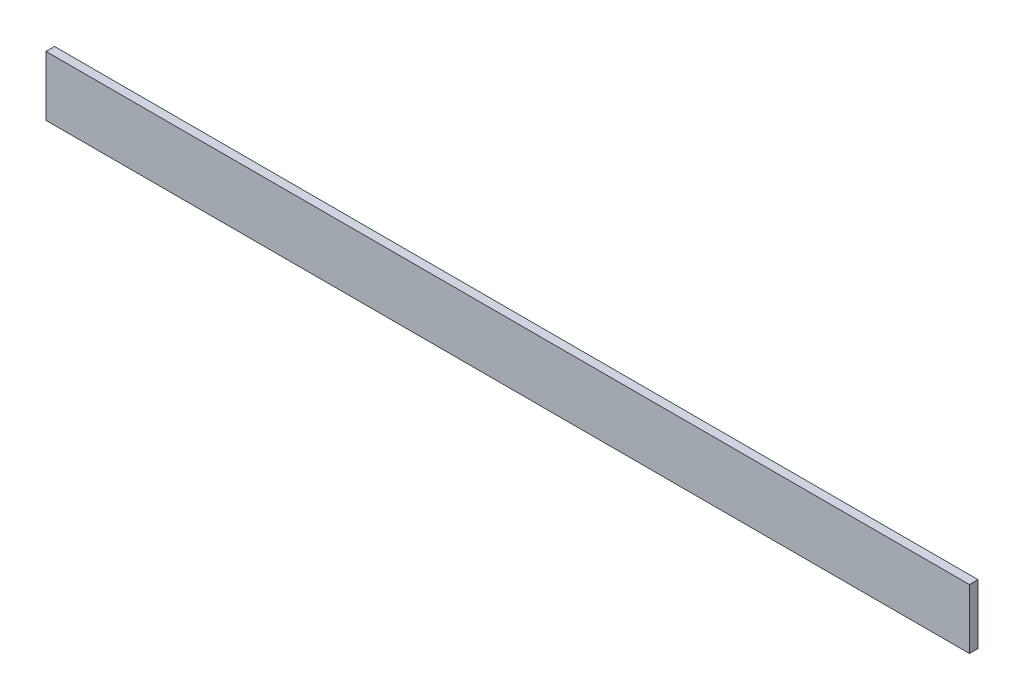
ISO-10303-21;
HEADER;
FILE_DESCRIPTION(('STEP AP214'),'2;1');
FILE_NAME('part.step','',(''),(''),'','','');
FILE_SCHEMA(('AUTOMOTIVE_DESIGN { 1 0 10303 214 1 1 1 1 }'));
ENDSEC;
DATA;
#1=APPLICATION_CONTEXT('core data for automotive mechanical design processes');
#2=APPLICATION_PROTOCOL_DEFINITION('international standard','automotive_design',2000,#1);
#3=PRODUCT_CONTEXT('',#1,'mechanical');
#4=PRODUCT('Part','Part','',(#3));
#5=PRODUCT_RELATED_PRODUCT_CATEGORY('part','',(#4));
#6=PRODUCT_DEFINITION_FORMATION('','',#4);
#7=PRODUCT_DEFINITION_CONTEXT('part definition',#1,'design');
#8=PRODUCT_DEFINITION('design','',#6,#7);
#9=PRODUCT_DEFINITION_SHAPE('','',#8);
#10=(LENGTH_UNIT() NAMED_UNIT(*) SI_UNIT(.MILLI.,.METRE.));
#11=(NAMED_UNIT(*) PLANE_ANGLE_UNIT() SI_UNIT($,.RADIAN.));
#12=(NAMED_UNIT(*) SI_UNIT($,.STERADIAN.) SOLID_ANGLE_UNIT());
#13=UNCERTAINTY_MEASURE_WITH_UNIT(LENGTH_MEASURE(1.E-05),#10,'distance_accuracy_value','');
#14=(GEOMETRIC_REPRESENTATION_CONTEXT(3) GLOBAL_UNCERTAINTY_ASSIGNED_CONTEXT((#13)) GLOBAL_UNIT_ASSIGNED_CONTEXT((#10,
#11,#12)) REPRESENTATION_CONTEXT('',''));
#15=CARTESIAN_POINT('',(0.,0.,0.));
#16=DIRECTION('',(0.,0.,1.));
#17=DIRECTION('',(1.,0.,0.));
#18=AXIS2_PLACEMENT_3D('',#15,#16,#17);
#19=CARTESIAN_POINT('',(541.,35.,-10.));
#20=DIRECTION('',(1.,0.,0.));
#21=DIRECTION('',(0.,0.,-1.));
#22=AXIS2_PLACEMENT_3D('',#19,#20,#21);
#23=PLANE('',#22);
#24=DIRECTION('',(0.,1.,0.));
#25=VECTOR('',#24,1.);
#26=CARTESIAN_POINT('',(541.,35.,0.));
#27=LINE('',#26,#25);
#28=CARTESIAN_POINT('',(541.,-35.,0.));
#29=VERTEX_POINT('',#28);
#30=CARTESIAN_POINT('',(541.,35.,0.));
#31=VERTEX_POINT('',#30);
#32=EDGE_CURVE('E100',#29,#31,#27,.T.);
#33=ORIENTED_EDGE('',*,*,#32,.F.);
#34=DIRECTION('',(0.,0.,1.));
#35=VECTOR('',#34,1.);
#36=CARTESIAN_POINT('',(541.,-35.,-10.));
#37=LINE('',#36,#35);
#38=CARTESIAN_POINT('',(541.,-35.,-10.));
#39=VERTEX_POINT('',#38);
#40=EDGE_CURVE('E11',#39,#29,#37,.T.);
#41=ORIENTED_EDGE('',*,*,#40,.F.);
#42=DIRECTION('',(0.,1.,0.));
#43=VECTOR('',#42,1.);
#44=CARTESIAN_POINT('',(541.,35.,-10.));
#45=LINE('',#44,#43);
#46=CARTESIAN_POINT('',(541.,35.,-10.));
#47=VERTEX_POINT('',#46);
#48=EDGE_CURVE('E94',#39,#47,#45,.T.);
#49=ORIENTED_EDGE('',*,*,#48,.T.);
#50=DIRECTION('',(0.,0.,1.));
#51=VECTOR('',#50,1.);
#52=CARTESIAN_POINT('',(541.,35.,-10.));
#53=LINE('',#52,#51);
#54=EDGE_CURVE('E39',#47,#31,#53,.T.);
#55=ORIENTED_EDGE('',*,*,#54,.T.);
#56=EDGE_LOOP('',(#33,#41,#49,#55));
#57=FACE_BOUND('',#56,.T.);
#58=ADVANCED_FACE('F36',(#57),#23,.T.);
#59=CARTESIAN_POINT('',(-541.,-35.,-10.));
#60=DIRECTION('',(0.,-1.,0.));
#61=DIRECTION('',(0.,0.,-1.));
#62=AXIS2_PLACEMENT_3D('',#59,#60,#61);
#63=PLANE('',#62);
#64=DIRECTION('',(1.,0.,0.));
#65=VECTOR('',#64,1.);
#66=CARTESIAN_POINT('',(-541.,-35.,0.));
#67=LINE('',#66,#65);
#68=CARTESIAN_POINT('',(-541.,-35.,0.));
#69=VERTEX_POINT('',#68);
#70=EDGE_CURVE('E96',#69,#29,#67,.T.);
#71=ORIENTED_EDGE('',*,*,#70,.F.);
#72=DIRECTION('',(0.,0.,1.));
#73=VECTOR('',#72,1.);
#74=CARTESIAN_POINT('',(-541.,-35.,-10.));
#75=LINE('',#74,#73);
#76=CARTESIAN_POINT('',(-541.,-35.,-10.));
#77=VERTEX_POINT('',#76);
#78=EDGE_CURVE('E45',#77,#69,#75,.T.);
#79=ORIENTED_EDGE('',*,*,#78,.F.);
#80=DIRECTION('',(1.,0.,0.));
#81=VECTOR('',#80,1.);
#82=CARTESIAN_POINT('',(-541.,-35.,-10.));
#83=LINE('',#82,#81);
#84=EDGE_CURVE('E91',#77,#39,#83,.T.);
#85=ORIENTED_EDGE('',*,*,#84,.T.);
#86=ORIENTED_EDGE('',*,*,#40,.T.);
#87=EDGE_LOOP('',(#71,#79,#85,#86));
#88=FACE_BOUND('',#87,.T.);
#89=ADVANCED_FACE('F110',(#88),#63,.T.);
#90=CARTESIAN_POINT('',(-541.,35.,-10.));
#91=DIRECTION('',(-1.,0.,0.));
#92=DIRECTION('',(0.,0.,1.));
#93=AXIS2_PLACEMENT_3D('',#90,#91,#92);
#94=PLANE('',#93);
#95=DIRECTION('',(0.,-1.,0.));
#96=VECTOR('',#95,1.);
#97=CARTESIAN_POINT('',(-541.,35.,0.));
#98=LINE('',#97,#96);
#99=CARTESIAN_POINT('',(-541.,35.,0.));
#100=VERTEX_POINT('',#99);
#101=EDGE_CURVE('E86',#100,#69,#98,.T.);
#102=ORIENTED_EDGE('',*,*,#101,.F.);
#103=DIRECTION('',(0.,0.,1.));
#104=VECTOR('',#103,1.);
#105=CARTESIAN_POINT('',(-541.,35.,-10.));
#106=LINE('',#105,#104);
#107=CARTESIAN_POINT('',(-541.,35.,-10.));
#108=VERTEX_POINT('',#107);
#109=EDGE_CURVE('E81',#108,#100,#106,.T.);
#110=ORIENTED_EDGE('',*,*,#109,.F.);
#111=DIRECTION('',(0.,-1.,0.));
#112=VECTOR('',#111,1.);
#113=CARTESIAN_POINT('',(-541.,35.,-10.));
#114=LINE('',#113,#112);
#115=EDGE_CURVE('E84',#108,#77,#114,.T.);
#116=ORIENTED_EDGE('',*,*,#115,.T.);
#117=ORIENTED_EDGE('',*,*,#78,.T.);
#118=EDGE_LOOP('',(#102,#110,#116,#117));
#119=FACE_BOUND('',#118,.T.);
#120=ADVANCED_FACE('F83',(#119),#94,.T.);
#121=CARTESIAN_POINT('',(-541.,35.,-10.));
#122=DIRECTION('',(0.,1.,0.));
#123=DIRECTION('',(0.,0.,1.));
#124=AXIS2_PLACEMENT_3D('',#121,#122,#123);
#125=PLANE('',#124);
#126=DIRECTION('',(-1.,0.,0.));
#127=VECTOR('',#126,1.);
#128=CARTESIAN_POINT('',(-541.,35.,0.));
#129=LINE('',#128,#127);
#130=EDGE_CURVE('E103',#31,#100,#129,.T.);
#131=ORIENTED_EDGE('',*,*,#130,.F.);
#132=ORIENTED_EDGE('',*,*,#54,.F.);
#133=DIRECTION('',(-1.,0.,0.));
#134=VECTOR('',#133,1.);
#135=CARTESIAN_POINT('',(-541.,35.,-10.));
#136=LINE('',#135,#134);
#137=EDGE_CURVE('E90',#47,#108,#136,.T.);
#138=ORIENTED_EDGE('',*,*,#137,.T.);
#139=ORIENTED_EDGE('',*,*,#109,.T.);
#140=EDGE_LOOP('',(#131,#132,#138,#139));
#141=FACE_BOUND('',#140,.T.);
#142=ADVANCED_FACE('F93',(#141),#125,.T.);
#143=CARTESIAN_POINT('',(0.,0.,-10.));
#144=DIRECTION('',(0.,0.,1.));
#145=DIRECTION('',(1.,0.,0.));
#146=AXIS2_PLACEMENT_3D('',#143,#144,#145);
#147=PLANE('',#146);
#148=ORIENTED_EDGE('',*,*,#48,.F.);
#149=ORIENTED_EDGE('',*,*,#84,.F.);
#150=ORIENTED_EDGE('',*,*,#115,.F.);
#151=ORIENTED_EDGE('',*,*,#137,.F.);
#152=EDGE_LOOP('',(#148,#149,#150,#151));
#153=FACE_BOUND('',#152,.T.);
#154=ADVANCED_FACE('F89',(#153),#147,.F.);
#155=CARTESIAN_POINT('',(0.,0.,0.));
#156=DIRECTION('',(0.,0.,1.));
#157=DIRECTION('',(1.,0.,0.));
#158=AXIS2_PLACEMENT_3D('',#155,#156,#157);
#159=PLANE('',#158);
#160=ORIENTED_EDGE('',*,*,#32,.T.);
#161=ORIENTED_EDGE('',*,*,#130,.T.);
#162=ORIENTED_EDGE('',*,*,#101,.T.);
#163=ORIENTED_EDGE('',*,*,#70,.T.);
#164=EDGE_LOOP('',(#160,#161,#162,#163));
#165=FACE_BOUND('',#164,.T.);
#166=ADVANCED_FACE('F109',(#165),#159,.T.);
#167=CLOSED_SHELL('',(#58,#89,#120,#142,#154,#166));
#168=MANIFOLD_SOLID_BREP('B2',#167);
#169=ADVANCED_BREP_SHAPE_REPRESENTATION('',(#18,#168),#14);
#170=SHAPE_DEFINITION_REPRESENTATION(#9,#169);
ENDSEC;
END-ISO-10303-21;
